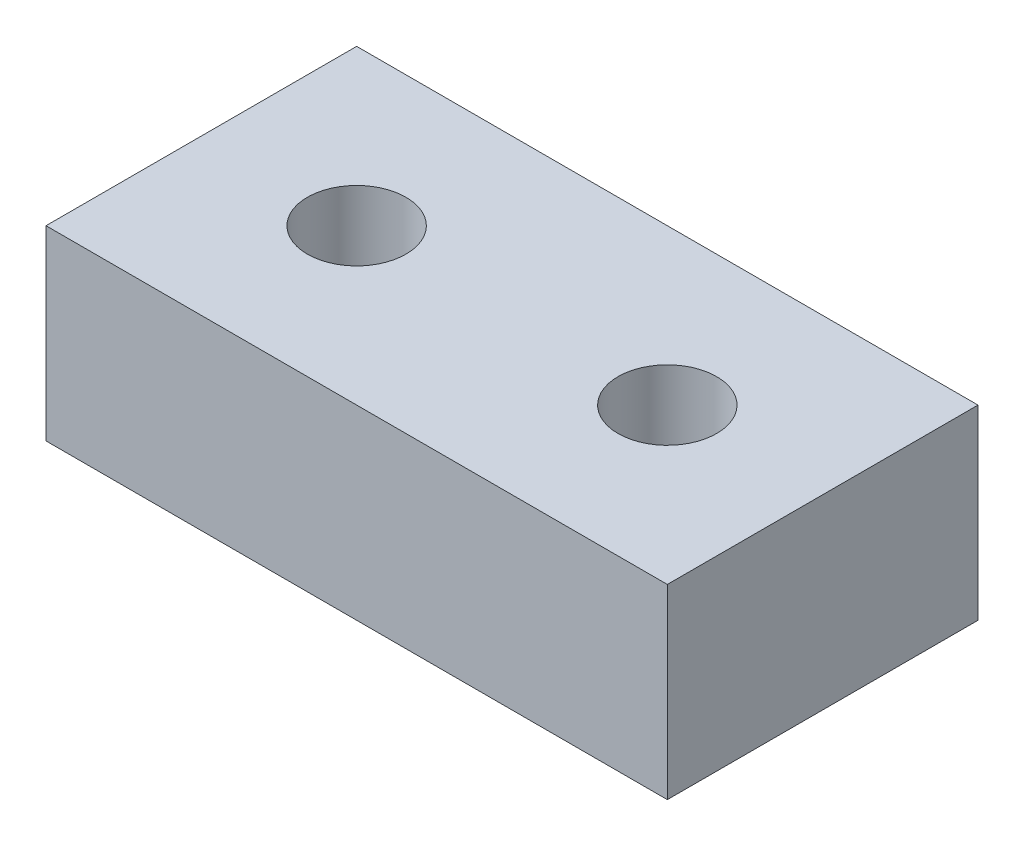
ISO-10303-21;
HEADER;
FILE_DESCRIPTION(('STEP AP214'),'2;1');
FILE_NAME('part.step','',(''),(''),'','','');
FILE_SCHEMA(('AUTOMOTIVE_DESIGN { 1 0 10303 214 1 1 1 1 }'));
ENDSEC;
DATA;
#1=APPLICATION_CONTEXT('core data for automotive mechanical design processes');
#2=APPLICATION_PROTOCOL_DEFINITION('international standard','automotive_design',2000,#1);
#3=PRODUCT_CONTEXT('',#1,'mechanical');
#4=PRODUCT('Part','Part','',(#3));
#5=PRODUCT_RELATED_PRODUCT_CATEGORY('part','',(#4));
#6=PRODUCT_DEFINITION_FORMATION('','',#4);
#7=PRODUCT_DEFINITION_CONTEXT('part definition',#1,'design');
#8=PRODUCT_DEFINITION('design','',#6,#7);
#9=PRODUCT_DEFINITION_SHAPE('','',#8);
#10=(LENGTH_UNIT() NAMED_UNIT(*) SI_UNIT(.MILLI.,.METRE.));
#11=(NAMED_UNIT(*) PLANE_ANGLE_UNIT() SI_UNIT($,.RADIAN.));
#12=(NAMED_UNIT(*) SI_UNIT($,.STERADIAN.) SOLID_ANGLE_UNIT());
#13=UNCERTAINTY_MEASURE_WITH_UNIT(LENGTH_MEASURE(1.E-05),#10,'distance_accuracy_value','');
#14=(GEOMETRIC_REPRESENTATION_CONTEXT(3) GLOBAL_UNCERTAINTY_ASSIGNED_CONTEXT((#13)) GLOBAL_UNIT_ASSIGNED_CONTEXT((#10,
#11,#12)) REPRESENTATION_CONTEXT('',''));
#15=CARTESIAN_POINT('',(0.,0.,0.));
#16=DIRECTION('',(0.,0.,1.));
#17=DIRECTION('',(1.,0.,0.));
#18=AXIS2_PLACEMENT_3D('',#15,#16,#17);
#19=CARTESIAN_POINT('',(0.,6.,-5.));
#20=DIRECTION('',(0.,0.,-1.));
#21=DIRECTION('',(-1.,0.,0.));
#22=AXIS2_PLACEMENT_3D('',#19,#20,#21);
#23=PLANE('',#22);
#24=DIRECTION('',(1.,0.,0.));
#25=VECTOR('',#24,1.);
#26=CARTESIAN_POINT('',(0.,0.,-5.));
#27=LINE('',#26,#25);
#28=CARTESIAN_POINT('',(-10.,0.,-5.));
#29=VERTEX_POINT('',#28);
#30=CARTESIAN_POINT('',(10.,0.,-5.));
#31=VERTEX_POINT('',#30);
#32=EDGE_CURVE('E105',#29,#31,#27,.T.);
#33=ORIENTED_EDGE('',*,*,#32,.F.);
#34=DIRECTION('',(0.,-1.,0.));
#35=VECTOR('',#34,1.);
#36=CARTESIAN_POINT('',(-10.,6.,-5.));
#37=LINE('',#36,#35);
#38=CARTESIAN_POINT('',(-10.,6.,-5.));
#39=VERTEX_POINT('',#38);
#40=EDGE_CURVE('E11',#39,#29,#37,.T.);
#41=ORIENTED_EDGE('',*,*,#40,.F.);
#42=DIRECTION('',(1.,0.,0.));
#43=VECTOR('',#42,1.);
#44=CARTESIAN_POINT('',(0.,6.,-5.));
#45=LINE('',#44,#43);
#46=CARTESIAN_POINT('',(10.,6.,-5.));
#47=VERTEX_POINT('',#46);
#48=EDGE_CURVE('E84',#39,#47,#45,.T.);
#49=ORIENTED_EDGE('',*,*,#48,.T.);
#50=DIRECTION('',(0.,-1.,0.));
#51=VECTOR('',#50,1.);
#52=CARTESIAN_POINT('',(10.,6.,-5.));
#53=LINE('',#52,#51);
#54=EDGE_CURVE('E51',#47,#31,#53,.T.);
#55=ORIENTED_EDGE('',*,*,#54,.T.);
#56=EDGE_LOOP('',(#33,#41,#49,#55));
#57=FACE_BOUND('',#56,.T.);
#58=ADVANCED_FACE('F35',(#57),#23,.T.);
#59=CARTESIAN_POINT('',(-10.,6.,0.));
#60=DIRECTION('',(1.,0.,0.));
#61=DIRECTION('',(0.,0.,-1.));
#62=AXIS2_PLACEMENT_3D('',#59,#60,#61);
#63=PLANE('',#62);
#64=DIRECTION('',(0.,0.,1.));
#65=VECTOR('',#64,1.);
#66=CARTESIAN_POINT('',(-10.,0.,0.));
#67=LINE('',#66,#65);
#68=CARTESIAN_POINT('',(-10.,0.,5.));
#69=VERTEX_POINT('',#68);
#70=EDGE_CURVE('E90',#29,#69,#67,.T.);
#71=ORIENTED_EDGE('',*,*,#70,.T.);
#72=DIRECTION('',(0.,-1.,0.));
#73=VECTOR('',#72,1.);
#74=CARTESIAN_POINT('',(-10.,6.,5.));
#75=LINE('',#74,#73);
#76=CARTESIAN_POINT('',(-10.,6.,5.));
#77=VERTEX_POINT('',#76);
#78=EDGE_CURVE('E43',#77,#69,#75,.T.);
#79=ORIENTED_EDGE('',*,*,#78,.F.);
#80=DIRECTION('',(0.,0.,1.));
#81=VECTOR('',#80,1.);
#82=CARTESIAN_POINT('',(-10.,6.,0.));
#83=LINE('',#82,#81);
#84=EDGE_CURVE('E77',#39,#77,#83,.T.);
#85=ORIENTED_EDGE('',*,*,#84,.F.);
#86=ORIENTED_EDGE('',*,*,#40,.T.);
#87=EDGE_LOOP('',(#71,#79,#85,#86));
#88=FACE_BOUND('',#87,.T.);
#89=ADVANCED_FACE('F88',(#88),#63,.F.);
#90=CARTESIAN_POINT('',(0.,6.,5.));
#91=DIRECTION('',(0.,0.,-1.));
#92=DIRECTION('',(-1.,0.,0.));
#93=AXIS2_PLACEMENT_3D('',#90,#91,#92);
#94=PLANE('',#93);
#95=DIRECTION('',(1.,0.,0.));
#96=VECTOR('',#95,1.);
#97=CARTESIAN_POINT('',(0.,0.,5.));
#98=LINE('',#97,#96);
#99=CARTESIAN_POINT('',(10.,0.,5.));
#100=VERTEX_POINT('',#99);
#101=EDGE_CURVE('E108',#69,#100,#98,.T.);
#102=ORIENTED_EDGE('',*,*,#101,.T.);
#103=DIRECTION('',(0.,-1.,0.));
#104=VECTOR('',#103,1.);
#105=CARTESIAN_POINT('',(10.,6.,5.));
#106=LINE('',#105,#104);
#107=CARTESIAN_POINT('',(10.,6.,5.));
#108=VERTEX_POINT('',#107);
#109=EDGE_CURVE('E65',#108,#100,#106,.T.);
#110=ORIENTED_EDGE('',*,*,#109,.F.);
#111=DIRECTION('',(1.,0.,0.));
#112=VECTOR('',#111,1.);
#113=CARTESIAN_POINT('',(0.,6.,5.));
#114=LINE('',#113,#112);
#115=EDGE_CURVE('E83',#77,#108,#114,.T.);
#116=ORIENTED_EDGE('',*,*,#115,.F.);
#117=ORIENTED_EDGE('',*,*,#78,.T.);
#118=EDGE_LOOP('',(#102,#110,#116,#117));
#119=FACE_BOUND('',#118,.T.);
#120=ADVANCED_FACE('F93',(#119),#94,.F.);
#121=CARTESIAN_POINT('',(-5.,6.,0.));
#122=DIRECTION('',(0.,-1.,0.));
#123=DIRECTION('',(0.,0.,-1.));
#124=AXIS2_PLACEMENT_3D('',#121,#122,#123);
#125=CYLINDRICAL_SURFACE('',#124,1.5875);
#126=CARTESIAN_POINT('',(-5.,6.,0.));
#127=DIRECTION('',(0.,1.,0.));
#128=DIRECTION('',(0.,0.,1.));
#129=AXIS2_PLACEMENT_3D('',#126,#127,#128);
#130=CIRCLE('',#129,1.5875);
#131=CARTESIAN_POINT('',(-5.,6.,1.5875));
#132=VERTEX_POINT('',#131);
#133=EDGE_CURVE('E96',#132,#132,#130,.T.);
#134=ORIENTED_EDGE('',*,*,#133,.T.);
#135=EDGE_LOOP('',(#134));
#136=FACE_BOUND('',#135,.T.);
#137=CARTESIAN_POINT('',(-5.,0.,0.));
#138=DIRECTION('',(0.,1.,0.));
#139=DIRECTION('',(0.,0.,1.));
#140=AXIS2_PLACEMENT_3D('',#137,#138,#139);
#141=CIRCLE('',#140,1.5875);
#142=CARTESIAN_POINT('',(-5.,0.,1.5875));
#143=VERTEX_POINT('',#142);
#144=EDGE_CURVE('E113',#143,#143,#141,.T.);
#145=ORIENTED_EDGE('',*,*,#144,.F.);
#146=EDGE_LOOP('',(#145));
#147=FACE_BOUND('',#146,.T.);
#148=ADVANCED_FACE('F125',(#136,#147),#125,.F.);
#149=CARTESIAN_POINT('',(10.,6.,0.));
#150=DIRECTION('',(1.,0.,0.));
#151=DIRECTION('',(0.,0.,-1.));
#152=AXIS2_PLACEMENT_3D('',#149,#150,#151);
#153=PLANE('',#152);
#154=DIRECTION('',(0.,0.,1.));
#155=VECTOR('',#154,1.);
#156=CARTESIAN_POINT('',(10.,0.,0.));
#157=LINE('',#156,#155);
#158=EDGE_CURVE('E110',#31,#100,#157,.T.);
#159=ORIENTED_EDGE('',*,*,#158,.F.);
#160=ORIENTED_EDGE('',*,*,#54,.F.);
#161=DIRECTION('',(0.,0.,1.));
#162=VECTOR('',#161,1.);
#163=CARTESIAN_POINT('',(10.,6.,0.));
#164=LINE('',#163,#162);
#165=EDGE_CURVE('E94',#47,#108,#164,.T.);
#166=ORIENTED_EDGE('',*,*,#165,.T.);
#167=ORIENTED_EDGE('',*,*,#109,.T.);
#168=EDGE_LOOP('',(#159,#160,#166,#167));
#169=FACE_BOUND('',#168,.T.);
#170=ADVANCED_FACE('F122',(#169),#153,.T.);
#171=CARTESIAN_POINT('',(5.,6.,0.));
#172=DIRECTION('',(0.,-1.,0.));
#173=DIRECTION('',(0.,0.,-1.));
#174=AXIS2_PLACEMENT_3D('',#171,#172,#173);
#175=CYLINDRICAL_SURFACE('',#174,1.5875);
#176=CARTESIAN_POINT('',(5.,6.,0.));
#177=DIRECTION('',(0.,1.,0.));
#178=DIRECTION('',(0.,0.,1.));
#179=AXIS2_PLACEMENT_3D('',#176,#177,#178);
#180=CIRCLE('',#179,1.5875);
#181=CARTESIAN_POINT('',(5.,6.,1.5875));
#182=VERTEX_POINT('',#181);
#183=EDGE_CURVE('E102',#182,#182,#180,.F.);
#184=ORIENTED_EDGE('',*,*,#183,.F.);
#185=EDGE_LOOP('',(#184));
#186=FACE_BOUND('',#185,.T.);
#187=CARTESIAN_POINT('',(5.,0.,0.));
#188=DIRECTION('',(0.,1.,0.));
#189=DIRECTION('',(0.,0.,1.));
#190=AXIS2_PLACEMENT_3D('',#187,#188,#189);
#191=CIRCLE('',#190,1.5875);
#192=CARTESIAN_POINT('',(5.,0.,1.5875));
#193=VERTEX_POINT('',#192);
#194=EDGE_CURVE('E116',#193,#193,#191,.F.);
#195=ORIENTED_EDGE('',*,*,#194,.T.);
#196=EDGE_LOOP('',(#195));
#197=FACE_BOUND('',#196,.T.);
#198=ADVANCED_FACE('F124',(#186,#197),#175,.F.);
#199=CARTESIAN_POINT('',(0.,6.,0.));
#200=DIRECTION('',(0.,1.,0.));
#201=DIRECTION('',(0.,0.,1.));
#202=AXIS2_PLACEMENT_3D('',#199,#200,#201);
#203=PLANE('',#202);
#204=ORIENTED_EDGE('',*,*,#48,.F.);
#205=ORIENTED_EDGE('',*,*,#84,.T.);
#206=ORIENTED_EDGE('',*,*,#115,.T.);
#207=ORIENTED_EDGE('',*,*,#165,.F.);
#208=EDGE_LOOP('',(#204,#205,#206,#207));
#209=FACE_BOUND('',#208,.T.);
#210=ORIENTED_EDGE('',*,*,#133,.F.);
#211=EDGE_LOOP('',(#210));
#212=FACE_BOUND('',#211,.T.);
#213=ORIENTED_EDGE('',*,*,#183,.T.);
#214=EDGE_LOOP('',(#213));
#215=FACE_BOUND('',#214,.T.);
#216=ADVANCED_FACE('F79',(#209,#212,#215),#203,.T.);
#217=CARTESIAN_POINT('',(0.,0.,0.));
#218=DIRECTION('',(0.,1.,0.));
#219=DIRECTION('',(0.,0.,1.));
#220=AXIS2_PLACEMENT_3D('',#217,#218,#219);
#221=PLANE('',#220);
#222=ORIENTED_EDGE('',*,*,#32,.T.);
#223=ORIENTED_EDGE('',*,*,#158,.T.);
#224=ORIENTED_EDGE('',*,*,#101,.F.);
#225=ORIENTED_EDGE('',*,*,#70,.F.);
#226=EDGE_LOOP('',(#222,#223,#224,#225));
#227=FACE_BOUND('',#226,.T.);
#228=ORIENTED_EDGE('',*,*,#144,.T.);
#229=EDGE_LOOP('',(#228));
#230=FACE_BOUND('',#229,.T.);
#231=ORIENTED_EDGE('',*,*,#194,.F.);
#232=EDGE_LOOP('',(#231));
#233=FACE_BOUND('',#232,.T.);
#234=ADVANCED_FACE('F169',(#227,#230,#233),#221,.F.);
#235=CLOSED_SHELL('',(#58,#89,#120,#148,#170,#198,#216,#234));
#236=MANIFOLD_SOLID_BREP('B2',#235);
#237=ADVANCED_BREP_SHAPE_REPRESENTATION('',(#18,#236),#14);
#238=SHAPE_DEFINITION_REPRESENTATION(#9,#237);
ENDSEC;
END-ISO-10303-21;
